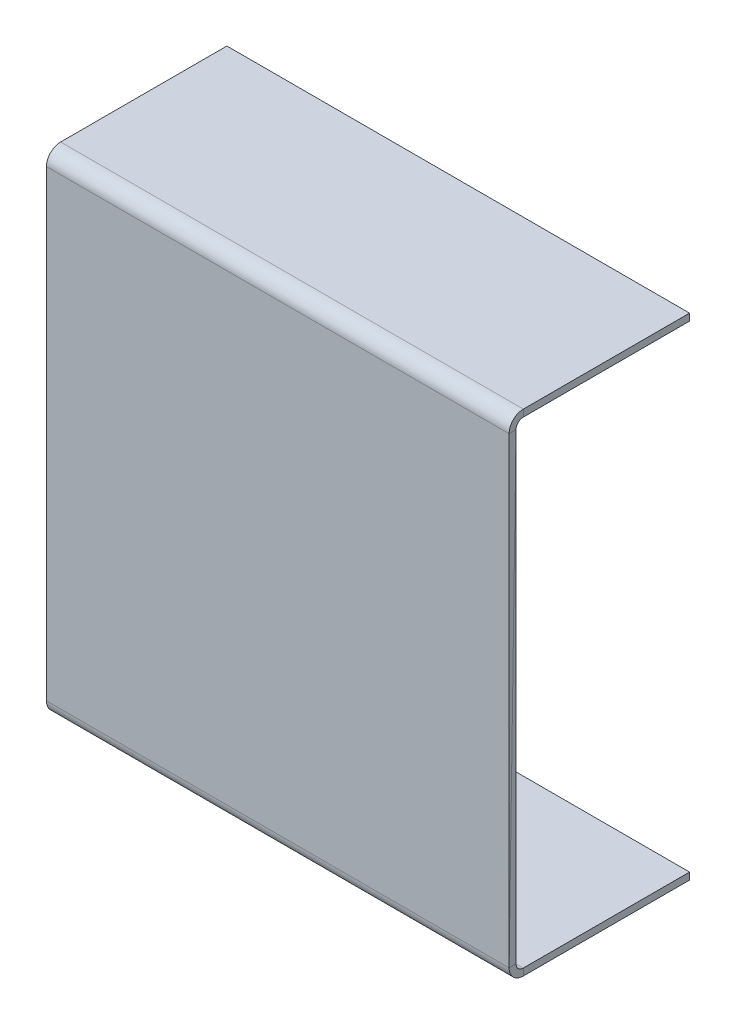
ISO-10303-21;
HEADER;
FILE_DESCRIPTION(('STEP AP214'),'2;1');
FILE_NAME('part.step','',(''),(''),'','','');
FILE_SCHEMA(('AUTOMOTIVE_DESIGN { 1 0 10303 214 1 1 1 1 }'));
ENDSEC;
DATA;
#1=APPLICATION_CONTEXT('core data for automotive mechanical design processes');
#2=APPLICATION_PROTOCOL_DEFINITION('international standard','automotive_design',2000,#1);
#3=PRODUCT_CONTEXT('',#1,'mechanical');
#4=PRODUCT('Part','Part','',(#3));
#5=PRODUCT_RELATED_PRODUCT_CATEGORY('part','',(#4));
#6=PRODUCT_DEFINITION_FORMATION('','',#4);
#7=PRODUCT_DEFINITION_CONTEXT('part definition',#1,'design');
#8=PRODUCT_DEFINITION('design','',#6,#7);
#9=PRODUCT_DEFINITION_SHAPE('','',#8);
#10=(LENGTH_UNIT() NAMED_UNIT(*) SI_UNIT(.MILLI.,.METRE.));
#11=(NAMED_UNIT(*) PLANE_ANGLE_UNIT() SI_UNIT($,.RADIAN.));
#12=(NAMED_UNIT(*) SI_UNIT($,.STERADIAN.) SOLID_ANGLE_UNIT());
#13=UNCERTAINTY_MEASURE_WITH_UNIT(LENGTH_MEASURE(1.E-05),#10,'distance_accuracy_value','');
#14=(GEOMETRIC_REPRESENTATION_CONTEXT(3) GLOBAL_UNCERTAINTY_ASSIGNED_CONTEXT((#13)) GLOBAL_UNIT_ASSIGNED_CONTEXT((#10,
#11,#12)) REPRESENTATION_CONTEXT('',''));
#15=CARTESIAN_POINT('',(0.,0.,0.));
#16=DIRECTION('',(0.,0.,1.));
#17=DIRECTION('',(1.,0.,0.));
#18=AXIS2_PLACEMENT_3D('',#15,#16,#17);
#19=CARTESIAN_POINT('',(101.6,0.,1.524));
#20=DIRECTION('',(-1.,0.,0.));
#21=DIRECTION('',(0.,1.,0.));
#22=AXIS2_PLACEMENT_3D('',#19,#20,#21);
#23=PLANE('',#22);
#24=DIRECTION('',(0.,0.,1.));
#25=VECTOR('',#24,1.);
#26=CARTESIAN_POINT('',(101.6,0.,1.524));
#27=LINE('',#26,#25);
#28=CARTESIAN_POINT('',(101.6,0.,0.));
#29=VERTEX_POINT('',#28);
#30=CARTESIAN_POINT('',(101.6,0.,1.524));
#31=VERTEX_POINT('',#30);
#32=EDGE_CURVE('E14',#29,#31,#27,.T.);
#33=ORIENTED_EDGE('',*,*,#32,.F.);
#34=DIRECTION('',(0.,1.,0.));
#35=VECTOR('',#34,1.);
#36=CARTESIAN_POINT('',(101.6,0.,0.));
#37=LINE('',#36,#35);
#38=CARTESIAN_POINT('',(101.6,101.6,0.));
#39=VERTEX_POINT('',#38);
#40=EDGE_CURVE('E287',#29,#39,#37,.T.);
#41=ORIENTED_EDGE('',*,*,#40,.T.);
#42=DIRECTION('',(0.,0.,1.));
#43=VECTOR('',#42,1.);
#44=CARTESIAN_POINT('',(101.6,101.6,1.524));
#45=LINE('',#44,#43);
#46=CARTESIAN_POINT('',(101.6,101.6,1.52399999999999));
#47=VERTEX_POINT('',#46);
#48=EDGE_CURVE('E97',#39,#47,#45,.T.);
#49=ORIENTED_EDGE('',*,*,#48,.T.);
#50=DIRECTION('',(0.,1.,0.));
#51=VECTOR('',#50,1.);
#52=CARTESIAN_POINT('',(101.6,0.,1.524));
#53=LINE('',#52,#51);
#54=EDGE_CURVE('E277',#31,#47,#53,.T.);
#55=ORIENTED_EDGE('',*,*,#54,.F.);
#56=EDGE_LOOP('',(#33,#41,#49,#55));
#57=FACE_BOUND('',#56,.T.);
#58=ADVANCED_FACE('F89',(#57),#23,.F.);
#59=CARTESIAN_POINT('',(0.,0.,1.524));
#60=DIRECTION('',(1.,0.,0.));
#61=DIRECTION('',(0.,-1.,0.));
#62=AXIS2_PLACEMENT_3D('',#59,#60,#61);
#63=PLANE('',#62);
#64=DIRECTION('',(0.,0.,1.));
#65=VECTOR('',#64,1.);
#66=CARTESIAN_POINT('',(0.,101.6,1.524));
#67=LINE('',#66,#65);
#68=CARTESIAN_POINT('',(0.,101.6,0.));
#69=VERTEX_POINT('',#68);
#70=CARTESIAN_POINT('',(0.,101.6,1.524));
#71=VERTEX_POINT('',#70);
#72=EDGE_CURVE('E291',#69,#71,#67,.T.);
#73=ORIENTED_EDGE('',*,*,#72,.F.);
#74=DIRECTION('',(0.,1.,0.));
#75=VECTOR('',#74,1.);
#76=CARTESIAN_POINT('',(0.,0.,0.));
#77=LINE('',#76,#75);
#78=CARTESIAN_POINT('',(0.,0.,0.));
#79=VERTEX_POINT('',#78);
#80=EDGE_CURVE('E261',#69,#79,#77,.F.);
#81=ORIENTED_EDGE('',*,*,#80,.T.);
#82=DIRECTION('',(0.,0.,1.));
#83=VECTOR('',#82,1.);
#84=CARTESIAN_POINT('',(0.,0.,1.524));
#85=LINE('',#84,#83);
#86=CARTESIAN_POINT('',(0.,0.,1.524));
#87=VERTEX_POINT('',#86);
#88=EDGE_CURVE('E92',#79,#87,#85,.T.);
#89=ORIENTED_EDGE('',*,*,#88,.T.);
#90=DIRECTION('',(0.,-1.,0.));
#91=VECTOR('',#90,1.);
#92=CARTESIAN_POINT('',(0.,0.,1.524));
#93=LINE('',#92,#91);
#94=EDGE_CURVE('E270',#71,#87,#93,.T.);
#95=ORIENTED_EDGE('',*,*,#94,.F.);
#96=EDGE_LOOP('',(#73,#81,#89,#95));
#97=FACE_BOUND('',#96,.T.);
#98=ADVANCED_FACE('F313',(#97),#63,.F.);
#99=CARTESIAN_POINT('',(0.,0.,1.524));
#100=DIRECTION('',(0.,0.,-1.));
#101=DIRECTION('',(-1.,0.,0.));
#102=AXIS2_PLACEMENT_3D('',#99,#100,#101);
#103=PLANE('',#102);
#104=ORIENTED_EDGE('',*,*,#94,.T.);
#105=DIRECTION('',(1.,0.,0.));
#106=VECTOR('',#105,1.);
#107=CARTESIAN_POINT('',(0.,0.,1.524));
#108=LINE('',#107,#106);
#109=EDGE_CURVE('E273',#87,#31,#108,.T.);
#110=ORIENTED_EDGE('',*,*,#109,.T.);
#111=ORIENTED_EDGE('',*,*,#54,.T.);
#112=DIRECTION('',(-1.,0.,0.));
#113=VECTOR('',#112,1.);
#114=CARTESIAN_POINT('',(0.,101.6,1.524));
#115=LINE('',#114,#113);
#116=EDGE_CURVE('E280',#47,#71,#115,.T.);
#117=ORIENTED_EDGE('',*,*,#116,.T.);
#118=EDGE_LOOP('',(#104,#110,#111,#117));
#119=FACE_BOUND('',#118,.T.);
#120=ADVANCED_FACE('F302',(#119),#103,.F.);
#121=CARTESIAN_POINT('',(0.,0.,0.));
#122=DIRECTION('',(0.,0.,-1.));
#123=DIRECTION('',(-1.,0.,0.));
#124=AXIS2_PLACEMENT_3D('',#121,#122,#123);
#125=PLANE('',#124);
#126=ORIENTED_EDGE('',*,*,#80,.F.);
#127=DIRECTION('',(-1.,0.,0.));
#128=VECTOR('',#127,1.);
#129=CARTESIAN_POINT('',(0.,101.6,0.));
#130=LINE('',#129,#128);
#131=EDGE_CURVE('E274',#39,#69,#130,.T.);
#132=ORIENTED_EDGE('',*,*,#131,.F.);
#133=ORIENTED_EDGE('',*,*,#40,.F.);
#134=DIRECTION('',(-1.,0.,0.));
#135=VECTOR('',#134,1.);
#136=CARTESIAN_POINT('',(0.,0.,0.));
#137=LINE('',#136,#135);
#138=EDGE_CURVE('E285',#79,#29,#137,.F.);
#139=ORIENTED_EDGE('',*,*,#138,.F.);
#140=EDGE_LOOP('',(#126,#132,#133,#139));
#141=FACE_BOUND('',#140,.T.);
#142=ADVANCED_FACE('F317',(#141),#125,.T.);
#143=CARTESIAN_POINT('',(101.6,0.,-1.5875));
#144=DIRECTION('',(1.,0.,0.));
#145=DIRECTION('',(0.,1.,0.));
#146=AXIS2_PLACEMENT_3D('',#143,#144,#145);
#147=PLANE('',#146);
#148=DIRECTION('',(0.,1.,0.));
#149=VECTOR('',#148,1.);
#150=CARTESIAN_POINT('',(101.6,-3.1115,-1.58749999999999));
#151=LINE('',#150,#149);
#152=CARTESIAN_POINT('',(101.6,-1.5875,-1.58749999999999));
#153=VERTEX_POINT('',#152);
#154=CARTESIAN_POINT('',(101.6,-3.1115,-1.58749999999999));
#155=VERTEX_POINT('',#154);
#156=EDGE_CURVE('E220',#153,#155,#151,.F.);
#157=ORIENTED_EDGE('',*,*,#156,.F.);
#158=CARTESIAN_POINT('',(101.6,0.,-1.5875));
#159=DIRECTION('',(-1.,0.,0.));
#160=DIRECTION('',(0.,-1.,0.));
#161=AXIS2_PLACEMENT_3D('',#158,#159,#160);
#162=CIRCLE('',#161,1.5875);
#163=EDGE_CURVE('E265',#29,#153,#162,.F.);
#164=ORIENTED_EDGE('',*,*,#163,.F.);
#165=ORIENTED_EDGE('',*,*,#32,.T.);
#166=CARTESIAN_POINT('',(101.6,0.,-1.5875));
#167=DIRECTION('',(-1.,0.,0.));
#168=DIRECTION('',(0.,-1.,0.));
#169=AXIS2_PLACEMENT_3D('',#166,#167,#168);
#170=CIRCLE('',#169,3.1115);
#171=EDGE_CURVE('E112',#31,#155,#170,.F.);
#172=ORIENTED_EDGE('',*,*,#171,.T.);
#173=EDGE_LOOP('',(#157,#164,#165,#172));
#174=FACE_BOUND('',#173,.T.);
#175=ADVANCED_FACE('F323',(#174),#147,.T.);
#176=CARTESIAN_POINT('',(0.,0.,-1.5875));
#177=DIRECTION('',(1.,0.,0.));
#178=DIRECTION('',(0.,1.,0.));
#179=AXIS2_PLACEMENT_3D('',#176,#177,#178);
#180=PLANE('',#179);
#181=CARTESIAN_POINT('',(0.,0.,-1.5875));
#182=DIRECTION('',(-1.,0.,0.));
#183=DIRECTION('',(0.,-1.,0.));
#184=AXIS2_PLACEMENT_3D('',#181,#182,#183);
#185=CIRCLE('',#184,1.5875);
#186=CARTESIAN_POINT('',(0.,-1.58750000000001,-1.58749999999999));
#187=VERTEX_POINT('',#186);
#188=EDGE_CURVE('E233',#187,#79,#185,.T.);
#189=ORIENTED_EDGE('',*,*,#188,.F.);
#190=DIRECTION('',(0.,1.,0.));
#191=VECTOR('',#190,1.);
#192=CARTESIAN_POINT('',(0.,-1.5875,-1.58749999999999));
#193=LINE('',#192,#191);
#194=CARTESIAN_POINT('',(0.,-3.1115,-1.58749999999999));
#195=VERTEX_POINT('',#194);
#196=EDGE_CURVE('E253',#187,#195,#193,.F.);
#197=ORIENTED_EDGE('',*,*,#196,.T.);
#198=CARTESIAN_POINT('',(0.,0.,-1.5875));
#199=DIRECTION('',(-1.,0.,0.));
#200=DIRECTION('',(0.,-1.,0.));
#201=AXIS2_PLACEMENT_3D('',#198,#199,#200);
#202=CIRCLE('',#201,3.1115);
#203=EDGE_CURVE('E262',#195,#87,#202,.T.);
#204=ORIENTED_EDGE('',*,*,#203,.T.);
#205=ORIENTED_EDGE('',*,*,#88,.F.);
#206=EDGE_LOOP('',(#189,#197,#204,#205));
#207=FACE_BOUND('',#206,.T.);
#208=ADVANCED_FACE('F308',(#207),#180,.F.);
#209=CARTESIAN_POINT('',(0.,0.,-1.5875));
#210=DIRECTION('',(-1.,0.,0.));
#211=DIRECTION('',(0.,-1.,0.));
#212=AXIS2_PLACEMENT_3D('',#209,#210,#211);
#213=CYLINDRICAL_SURFACE('',#212,3.1115);
#214=ORIENTED_EDGE('',*,*,#109,.F.);
#215=ORIENTED_EDGE('',*,*,#203,.F.);
#216=DIRECTION('',(-1.,0.,0.));
#217=VECTOR('',#216,1.);
#218=CARTESIAN_POINT('',(101.6,-3.1115,-1.58749999999999));
#219=LINE('',#218,#217);
#220=EDGE_CURVE('E251',#195,#155,#219,.F.);
#221=ORIENTED_EDGE('',*,*,#220,.T.);
#222=ORIENTED_EDGE('',*,*,#171,.F.);
#223=EDGE_LOOP('',(#214,#215,#221,#222));
#224=FACE_BOUND('',#223,.T.);
#225=ADVANCED_FACE('F304',(#224),#213,.T.);
#226=CARTESIAN_POINT('',(0.,0.,-1.5875));
#227=DIRECTION('',(-1.,0.,0.));
#228=DIRECTION('',(0.,-1.,0.));
#229=AXIS2_PLACEMENT_3D('',#226,#227,#228);
#230=CYLINDRICAL_SURFACE('',#229,1.5875);
#231=ORIENTED_EDGE('',*,*,#138,.T.);
#232=ORIENTED_EDGE('',*,*,#163,.T.);
#233=DIRECTION('',(-1.,0.,0.));
#234=VECTOR('',#233,1.);
#235=CARTESIAN_POINT('',(101.6,-1.5875,-1.58749999999999));
#236=LINE('',#235,#234);
#237=EDGE_CURVE('E256',#153,#187,#236,.T.);
#238=ORIENTED_EDGE('',*,*,#237,.T.);
#239=ORIENTED_EDGE('',*,*,#188,.T.);
#240=EDGE_LOOP('',(#231,#232,#238,#239));
#241=FACE_BOUND('',#240,.T.);
#242=ADVANCED_FACE('F320',(#241),#230,.F.);
#243=CARTESIAN_POINT('',(0.,-3.11150000000013,-38.1));
#244=DIRECTION('',(1.,0.,0.));
#245=DIRECTION('',(0.,0.,-1.));
#246=AXIS2_PLACEMENT_3D('',#243,#244,#245);
#247=PLANE('',#246);
#248=ORIENTED_EDGE('',*,*,#196,.F.);
#249=DIRECTION('',(0.,0.,1.));
#250=VECTOR('',#249,1.);
#251=CARTESIAN_POINT('',(0.,-1.58750000000013,-38.1));
#252=LINE('',#251,#250);
#253=CARTESIAN_POINT('',(0.,-1.58750000000013,-38.1));
#254=VERTEX_POINT('',#253);
#255=EDGE_CURVE('E249',#187,#254,#252,.F.);
#256=ORIENTED_EDGE('',*,*,#255,.T.);
#257=DIRECTION('',(0.,1.,0.));
#258=VECTOR('',#257,1.);
#259=CARTESIAN_POINT('',(0.,-3.11150000000013,-38.1));
#260=LINE('',#259,#258);
#261=CARTESIAN_POINT('',(0.,-3.11150000000013,-38.1));
#262=VERTEX_POINT('',#261);
#263=EDGE_CURVE('E230',#262,#254,#260,.T.);
#264=ORIENTED_EDGE('',*,*,#263,.F.);
#265=DIRECTION('',(0.,0.,-1.));
#266=VECTOR('',#265,1.);
#267=CARTESIAN_POINT('',(0.,-3.11149999999999,0.));
#268=LINE('',#267,#266);
#269=EDGE_CURVE('E242',#195,#262,#268,.T.);
#270=ORIENTED_EDGE('',*,*,#269,.F.);
#271=EDGE_LOOP('',(#248,#256,#264,#270));
#272=FACE_BOUND('',#271,.T.);
#273=ADVANCED_FACE('F341',(#272),#247,.F.);
#274=CARTESIAN_POINT('',(101.6,-3.11149999999999,0.));
#275=DIRECTION('',(-1.,0.,0.));
#276=DIRECTION('',(0.,0.,1.));
#277=AXIS2_PLACEMENT_3D('',#274,#275,#276);
#278=PLANE('',#277);
#279=ORIENTED_EDGE('',*,*,#156,.T.);
#280=DIRECTION('',(0.,0.,1.));
#281=VECTOR('',#280,1.);
#282=CARTESIAN_POINT('',(101.6,-3.11149999999999,0.));
#283=LINE('',#282,#281);
#284=CARTESIAN_POINT('',(101.6,-3.11150000000013,-38.1));
#285=VERTEX_POINT('',#284);
#286=EDGE_CURVE('E237',#285,#155,#283,.T.);
#287=ORIENTED_EDGE('',*,*,#286,.F.);
#288=DIRECTION('',(0.,1.,0.));
#289=VECTOR('',#288,1.);
#290=CARTESIAN_POINT('',(101.6,-3.11150000000013,-38.1));
#291=LINE('',#290,#289);
#292=CARTESIAN_POINT('',(101.6,-1.58750000000013,-38.1));
#293=VERTEX_POINT('',#292);
#294=EDGE_CURVE('E234',#285,#293,#291,.T.);
#295=ORIENTED_EDGE('',*,*,#294,.T.);
#296=DIRECTION('',(0.,0.,-1.));
#297=VECTOR('',#296,1.);
#298=CARTESIAN_POINT('',(101.6,-1.58749999999999,0.));
#299=LINE('',#298,#297);
#300=EDGE_CURVE('E244',#293,#153,#299,.F.);
#301=ORIENTED_EDGE('',*,*,#300,.T.);
#302=EDGE_LOOP('',(#279,#287,#295,#301));
#303=FACE_BOUND('',#302,.T.);
#304=ADVANCED_FACE('F326',(#303),#278,.F.);
#305=CARTESIAN_POINT('',(0.,-3.11149999999999,0.));
#306=DIRECTION('',(0.,1.,0.));
#307=DIRECTION('',(0.,0.,1.));
#308=AXIS2_PLACEMENT_3D('',#305,#306,#307);
#309=PLANE('',#308);
#310=ORIENTED_EDGE('',*,*,#220,.F.);
#311=ORIENTED_EDGE('',*,*,#269,.T.);
#312=DIRECTION('',(1.,0.,0.));
#313=VECTOR('',#312,1.);
#314=CARTESIAN_POINT('',(0.,-3.11150000000013,-38.1));
#315=LINE('',#314,#313);
#316=EDGE_CURVE('E240',#262,#285,#315,.T.);
#317=ORIENTED_EDGE('',*,*,#316,.T.);
#318=ORIENTED_EDGE('',*,*,#286,.T.);
#319=EDGE_LOOP('',(#310,#311,#317,#318));
#320=FACE_BOUND('',#319,.T.);
#321=ADVANCED_FACE('F329',(#320),#309,.F.);
#322=CARTESIAN_POINT('',(0.,-1.58749999999999,0.));
#323=DIRECTION('',(0.,1.,0.));
#324=DIRECTION('',(0.,0.,1.));
#325=AXIS2_PLACEMENT_3D('',#322,#323,#324);
#326=PLANE('',#325);
#327=ORIENTED_EDGE('',*,*,#255,.F.);
#328=ORIENTED_EDGE('',*,*,#237,.F.);
#329=ORIENTED_EDGE('',*,*,#300,.F.);
#330=DIRECTION('',(-1.,0.,0.));
#331=VECTOR('',#330,1.);
#332=CARTESIAN_POINT('',(101.6,-1.58750000000013,-38.1));
#333=LINE('',#332,#331);
#334=EDGE_CURVE('E247',#254,#293,#333,.F.);
#335=ORIENTED_EDGE('',*,*,#334,.F.);
#336=EDGE_LOOP('',(#327,#328,#329,#335));
#337=FACE_BOUND('',#336,.T.);
#338=ADVANCED_FACE('F339',(#337),#326,.T.);
#339=CARTESIAN_POINT('',(101.6,-3.11150000000013,-38.1));
#340=DIRECTION('',(0.,0.,1.));
#341=DIRECTION('',(0.,-1.,0.));
#342=AXIS2_PLACEMENT_3D('',#339,#340,#341);
#343=PLANE('',#342);
#344=ORIENTED_EDGE('',*,*,#334,.T.);
#345=ORIENTED_EDGE('',*,*,#294,.F.);
#346=ORIENTED_EDGE('',*,*,#316,.F.);
#347=ORIENTED_EDGE('',*,*,#263,.T.);
#348=EDGE_LOOP('',(#344,#345,#346,#347));
#349=FACE_BOUND('',#348,.T.);
#350=ADVANCED_FACE('F335',(#349),#343,.F.);
#351=CARTESIAN_POINT('',(0.,101.6,-1.5875));
#352=DIRECTION('',(-1.,0.,0.));
#353=DIRECTION('',(0.,0.,1.));
#354=AXIS2_PLACEMENT_3D('',#351,#352,#353);
#355=PLANE('',#354);
#356=DIRECTION('',(0.,-1.,0.));
#357=VECTOR('',#356,1.);
#358=CARTESIAN_POINT('',(0.,104.7115,-1.58749999999999));
#359=LINE('',#358,#357);
#360=CARTESIAN_POINT('',(0.,103.1875,-1.58749999999999));
#361=VERTEX_POINT('',#360);
#362=CARTESIAN_POINT('',(0.,104.7115,-1.58749999999999));
#363=VERTEX_POINT('',#362);
#364=EDGE_CURVE('E201',#361,#363,#359,.F.);
#365=ORIENTED_EDGE('',*,*,#364,.F.);
#366=CARTESIAN_POINT('',(0.,101.6,-1.5875));
#367=DIRECTION('',(1.,0.,0.));
#368=DIRECTION('',(0.,0.,-1.));
#369=AXIS2_PLACEMENT_3D('',#366,#367,#368);
#370=CIRCLE('',#369,1.58749999999999);
#371=EDGE_CURVE('E224',#69,#361,#370,.F.);
#372=ORIENTED_EDGE('',*,*,#371,.F.);
#373=ORIENTED_EDGE('',*,*,#72,.T.);
#374=CARTESIAN_POINT('',(0.,101.6,-1.5875));
#375=DIRECTION('',(1.,0.,0.));
#376=DIRECTION('',(0.,0.,-1.));
#377=AXIS2_PLACEMENT_3D('',#374,#375,#376);
#378=CIRCLE('',#377,3.11149999999999);
#379=EDGE_CURVE('E104',#71,#363,#378,.F.);
#380=ORIENTED_EDGE('',*,*,#379,.T.);
#381=EDGE_LOOP('',(#365,#372,#373,#380));
#382=FACE_BOUND('',#381,.T.);
#383=ADVANCED_FACE('F414',(#382),#355,.T.);
#384=CARTESIAN_POINT('',(101.6,101.6,-1.5875));
#385=DIRECTION('',(-1.,0.,0.));
#386=DIRECTION('',(0.,0.,1.));
#387=AXIS2_PLACEMENT_3D('',#384,#385,#386);
#388=PLANE('',#387);
#389=CARTESIAN_POINT('',(101.6,101.6,-1.5875));
#390=DIRECTION('',(1.,0.,0.));
#391=DIRECTION('',(0.,0.,-1.));
#392=AXIS2_PLACEMENT_3D('',#389,#390,#391);
#393=CIRCLE('',#392,1.58749999999999);
#394=CARTESIAN_POINT('',(101.6,103.1875,-1.58749999999999));
#395=VERTEX_POINT('',#394);
#396=EDGE_CURVE('E227',#395,#39,#393,.T.);
#397=ORIENTED_EDGE('',*,*,#396,.F.);
#398=DIRECTION('',(0.,-1.,0.));
#399=VECTOR('',#398,1.);
#400=CARTESIAN_POINT('',(101.6,103.1875,-1.58749999999999));
#401=LINE('',#400,#399);
#402=CARTESIAN_POINT('',(101.6,104.7115,-1.58749999999999));
#403=VERTEX_POINT('',#402);
#404=EDGE_CURVE('E213',#395,#403,#401,.F.);
#405=ORIENTED_EDGE('',*,*,#404,.T.);
#406=CARTESIAN_POINT('',(101.6,101.6,-1.5875));
#407=DIRECTION('',(1.,0.,0.));
#408=DIRECTION('',(0.,0.,-1.));
#409=AXIS2_PLACEMENT_3D('',#406,#407,#408);
#410=CIRCLE('',#409,3.11149999999999);
#411=EDGE_CURVE('E221',#403,#47,#410,.T.);
#412=ORIENTED_EDGE('',*,*,#411,.T.);
#413=ORIENTED_EDGE('',*,*,#48,.F.);
#414=EDGE_LOOP('',(#397,#405,#412,#413));
#415=FACE_BOUND('',#414,.T.);
#416=ADVANCED_FACE('F449',(#415),#388,.F.);
#417=CARTESIAN_POINT('',(101.6,101.6,-1.5875));
#418=DIRECTION('',(1.,0.,0.));
#419=DIRECTION('',(0.,1.,0.));
#420=AXIS2_PLACEMENT_3D('',#417,#418,#419);
#421=CYLINDRICAL_SURFACE('',#420,3.11149999999999);
#422=ORIENTED_EDGE('',*,*,#116,.F.);
#423=ORIENTED_EDGE('',*,*,#411,.F.);
#424=DIRECTION('',(1.,0.,0.));
#425=VECTOR('',#424,1.);
#426=CARTESIAN_POINT('',(0.,104.7115,-1.58749999999999));
#427=LINE('',#426,#425);
#428=EDGE_CURVE('E211',#403,#363,#427,.F.);
#429=ORIENTED_EDGE('',*,*,#428,.T.);
#430=ORIENTED_EDGE('',*,*,#379,.F.);
#431=EDGE_LOOP('',(#422,#423,#429,#430));
#432=FACE_BOUND('',#431,.T.);
#433=ADVANCED_FACE('F460',(#432),#421,.T.);
#434=CARTESIAN_POINT('',(101.6,101.6,-1.5875));
#435=DIRECTION('',(1.,0.,0.));
#436=DIRECTION('',(0.,1.,0.));
#437=AXIS2_PLACEMENT_3D('',#434,#435,#436);
#438=CYLINDRICAL_SURFACE('',#437,1.58749999999999);
#439=ORIENTED_EDGE('',*,*,#131,.T.);
#440=ORIENTED_EDGE('',*,*,#371,.T.);
#441=DIRECTION('',(1.,0.,0.));
#442=VECTOR('',#441,1.);
#443=CARTESIAN_POINT('',(0.,103.1875,-1.58749999999999));
#444=LINE('',#443,#442);
#445=EDGE_CURVE('E216',#361,#395,#444,.T.);
#446=ORIENTED_EDGE('',*,*,#445,.T.);
#447=ORIENTED_EDGE('',*,*,#396,.T.);
#448=EDGE_LOOP('',(#439,#440,#446,#447));
#449=FACE_BOUND('',#448,.T.);
#450=ADVANCED_FACE('F470',(#449),#438,.F.);
#451=CARTESIAN_POINT('',(101.6,104.7115,-38.1));
#452=DIRECTION('',(-1.,0.,0.));
#453=DIRECTION('',(0.,0.,1.));
#454=AXIS2_PLACEMENT_3D('',#451,#452,#453);
#455=PLANE('',#454);
#456=ORIENTED_EDGE('',*,*,#404,.F.);
#457=DIRECTION('',(0.,0.,1.));
#458=VECTOR('',#457,1.);
#459=CARTESIAN_POINT('',(101.6,103.1875,-38.1));
#460=LINE('',#459,#458);
#461=CARTESIAN_POINT('',(101.6,103.1875,-38.1));
#462=VERTEX_POINT('',#461);
#463=EDGE_CURVE('E209',#395,#462,#460,.F.);
#464=ORIENTED_EDGE('',*,*,#463,.T.);
#465=DIRECTION('',(0.,-1.,0.));
#466=VECTOR('',#465,1.);
#467=CARTESIAN_POINT('',(101.6,104.7115,-38.1));
#468=LINE('',#467,#466);
#469=CARTESIAN_POINT('',(101.6,104.7115,-38.1));
#470=VERTEX_POINT('',#469);
#471=EDGE_CURVE('E197',#470,#462,#468,.T.);
#472=ORIENTED_EDGE('',*,*,#471,.F.);
#473=DIRECTION('',(0.,0.,-1.));
#474=VECTOR('',#473,1.);
#475=CARTESIAN_POINT('',(101.6,104.7115,3.75395359102116E-13));
#476=LINE('',#475,#474);
#477=EDGE_CURVE('E184',#403,#470,#476,.T.);
#478=ORIENTED_EDGE('',*,*,#477,.F.);
#479=EDGE_LOOP('',(#456,#464,#472,#478));
#480=FACE_BOUND('',#479,.T.);
#481=ADVANCED_FACE('F480',(#480),#455,.F.);
#482=CARTESIAN_POINT('',(0.,104.7115,0.));
#483=DIRECTION('',(1.,0.,0.));
#484=DIRECTION('',(0.,0.,-1.));
#485=AXIS2_PLACEMENT_3D('',#482,#483,#484);
#486=PLANE('',#485);
#487=ORIENTED_EDGE('',*,*,#364,.T.);
#488=DIRECTION('',(0.,0.,1.));
#489=VECTOR('',#488,1.);
#490=CARTESIAN_POINT('',(0.,104.7115,3.75395359102116E-13));
#491=LINE('',#490,#489);
#492=CARTESIAN_POINT('',(0.,104.7115,-38.1));
#493=VERTEX_POINT('',#492);
#494=EDGE_CURVE('E182',#493,#363,#491,.T.);
#495=ORIENTED_EDGE('',*,*,#494,.F.);
#496=DIRECTION('',(0.,-1.,0.));
#497=VECTOR('',#496,1.);
#498=CARTESIAN_POINT('',(0.,104.7115,-38.1));
#499=LINE('',#498,#497);
#500=CARTESIAN_POINT('',(0.,103.1875,-38.1));
#501=VERTEX_POINT('',#500);
#502=EDGE_CURVE('E190',#493,#501,#499,.T.);
#503=ORIENTED_EDGE('',*,*,#502,.T.);
#504=DIRECTION('',(0.,0.,-1.));
#505=VECTOR('',#504,1.);
#506=CARTESIAN_POINT('',(0.,103.1875,0.));
#507=LINE('',#506,#505);
#508=EDGE_CURVE('E206',#501,#361,#507,.F.);
#509=ORIENTED_EDGE('',*,*,#508,.T.);
#510=EDGE_LOOP('',(#487,#495,#503,#509));
#511=FACE_BOUND('',#510,.T.);
#512=ADVANCED_FACE('F200',(#511),#486,.F.);
#513=CARTESIAN_POINT('',(0.,104.7115,3.75395359102116E-13));
#514=DIRECTION('',(0.,-1.,0.));
#515=DIRECTION('',(0.,0.,-1.));
#516=AXIS2_PLACEMENT_3D('',#513,#514,#515);
#517=PLANE('',#516);
#518=ORIENTED_EDGE('',*,*,#428,.F.);
#519=ORIENTED_EDGE('',*,*,#477,.T.);
#520=DIRECTION('',(-1.,0.,0.));
#521=VECTOR('',#520,1.);
#522=CARTESIAN_POINT('',(0.,104.7115,-38.1));
#523=LINE('',#522,#521);
#524=EDGE_CURVE('E177',#470,#493,#523,.T.);
#525=ORIENTED_EDGE('',*,*,#524,.T.);
#526=ORIENTED_EDGE('',*,*,#494,.T.);
#527=EDGE_LOOP('',(#518,#519,#525,#526));
#528=FACE_BOUND('',#527,.T.);
#529=ADVANCED_FACE('F180',(#528),#517,.F.);
#530=CARTESIAN_POINT('',(0.,103.1875,3.70074341541719E-13));
#531=DIRECTION('',(0.,-1.,0.));
#532=DIRECTION('',(0.,0.,-1.));
#533=AXIS2_PLACEMENT_3D('',#530,#531,#532);
#534=PLANE('',#533);
#535=ORIENTED_EDGE('',*,*,#463,.F.);
#536=ORIENTED_EDGE('',*,*,#445,.F.);
#537=ORIENTED_EDGE('',*,*,#508,.F.);
#538=DIRECTION('',(1.,0.,0.));
#539=VECTOR('',#538,1.);
#540=CARTESIAN_POINT('',(0.,103.1875,-38.1));
#541=LINE('',#540,#539);
#542=EDGE_CURVE('E193',#462,#501,#541,.F.);
#543=ORIENTED_EDGE('',*,*,#542,.F.);
#544=EDGE_LOOP('',(#535,#536,#537,#543));
#545=FACE_BOUND('',#544,.T.);
#546=ADVANCED_FACE('F510',(#545),#534,.T.);
#547=CARTESIAN_POINT('',(0.,104.7115,-38.1));
#548=DIRECTION('',(0.,0.,1.));
#549=DIRECTION('',(0.,-1.,0.));
#550=AXIS2_PLACEMENT_3D('',#547,#548,#549);
#551=PLANE('',#550);
#552=ORIENTED_EDGE('',*,*,#542,.T.);
#553=ORIENTED_EDGE('',*,*,#502,.F.);
#554=ORIENTED_EDGE('',*,*,#524,.F.);
#555=ORIENTED_EDGE('',*,*,#471,.T.);
#556=EDGE_LOOP('',(#552,#553,#554,#555));
#557=FACE_BOUND('',#556,.T.);
#558=ADVANCED_FACE('F191',(#557),#551,.F.);
#559=CLOSED_SHELL('',(#58,#98,#120,#142,#175,#208,#225,#242,#273,#304,#321,#338,#350,#383,#416,
#433,#450,#481,#512,#529,#546,#558));
#560=MANIFOLD_SOLID_BREP('B2',#559);
#561=CARTESIAN_POINT('',(0.,0.,1.524));
#562=DIRECTION('',(1.,0.,0.));
#563=DIRECTION('',(0.,1.,0.));
#564=AXIS2_PLACEMENT_3D('',#561,#562,#563);
#565=PLANE('',#564);
#566=DIRECTION('',(0.,-1.,0.));
#567=VECTOR('',#566,1.);
#568=CARTESIAN_POINT('',(0.,0.,0.));
#569=LINE('',#568,#567);
#570=CARTESIAN_POINT('',(0.,101.6,0.));
#571=VERTEX_POINT('',#570);
#572=CARTESIAN_POINT('',(0.,0.,0.));
#573=VERTEX_POINT('',#572);
#574=EDGE_CURVE('E649',#571,#573,#569,.T.);
#575=ORIENTED_EDGE('',*,*,#574,.T.);
#576=DIRECTION('',(0.,0.,-1.));
#577=VECTOR('',#576,1.);
#578=CARTESIAN_POINT('',(0.,0.,1.524));
#579=LINE('',#578,#577);
#580=CARTESIAN_POINT('',(0.,0.,1.524));
#581=VERTEX_POINT('',#580);
#582=EDGE_CURVE('E87',#581,#573,#579,.T.);
#583=ORIENTED_EDGE('',*,*,#582,.F.);
#584=DIRECTION('',(0.,-1.,0.));
#585=VECTOR('',#584,1.);
#586=CARTESIAN_POINT('',(0.,0.,1.524));
#587=LINE('',#586,#585);
#588=CARTESIAN_POINT('',(0.,101.6,1.524));
#589=VERTEX_POINT('',#588);
#590=EDGE_CURVE('E634',#589,#581,#587,.T.);
#591=ORIENTED_EDGE('',*,*,#590,.F.);
#592=DIRECTION('',(0.,0.,-1.));
#593=VECTOR('',#592,1.);
#594=CARTESIAN_POINT('',(0.,101.6,1.524));
#595=LINE('',#594,#593);
#596=EDGE_CURVE('E645',#589,#571,#595,.T.);
#597=ORIENTED_EDGE('',*,*,#596,.T.);
#598=EDGE_LOOP('',(#575,#583,#591,#597));
#599=FACE_BOUND('',#598,.T.);
#600=ADVANCED_FACE('F583',(#599),#565,.F.);
#601=CARTESIAN_POINT('',(0.,0.,1.524));
#602=DIRECTION('',(0.,1.,0.));
#603=DIRECTION('',(0.,0.,1.));
#604=AXIS2_PLACEMENT_3D('',#601,#602,#603);
#605=PLANE('',#604);
#606=DIRECTION('',(1.,0.,0.));
#607=VECTOR('',#606,1.);
#608=CARTESIAN_POINT('',(0.,0.,0.));
#609=LINE('',#608,#607);
#610=CARTESIAN_POINT('',(101.6,0.,0.));
#611=VERTEX_POINT('',#610);
#612=EDGE_CURVE('E639',#573,#611,#609,.T.);
#613=ORIENTED_EDGE('',*,*,#612,.T.);
#614=DIRECTION('',(0.,0.,-1.));
#615=VECTOR('',#614,1.);
#616=CARTESIAN_POINT('',(101.6,0.,1.524));
#617=LINE('',#616,#615);
#618=CARTESIAN_POINT('',(101.6,0.,1.524));
#619=VERTEX_POINT('',#618);
#620=EDGE_CURVE('E591',#619,#611,#617,.T.);
#621=ORIENTED_EDGE('',*,*,#620,.F.);
#622=DIRECTION('',(1.,0.,0.));
#623=VECTOR('',#622,1.);
#624=CARTESIAN_POINT('',(0.,0.,1.524));
#625=LINE('',#624,#623);
#626=EDGE_CURVE('E629',#581,#619,#625,.T.);
#627=ORIENTED_EDGE('',*,*,#626,.F.);
#628=ORIENTED_EDGE('',*,*,#582,.T.);
#629=EDGE_LOOP('',(#613,#621,#627,#628));
#630=FACE_BOUND('',#629,.T.);
#631=ADVANCED_FACE('F638',(#630),#605,.F.);
#632=CARTESIAN_POINT('',(101.6,0.,1.524));
#633=DIRECTION('',(-1.,0.,0.));
#634=DIRECTION('',(0.,0.,1.));
#635=AXIS2_PLACEMENT_3D('',#632,#633,#634);
#636=PLANE('',#635);
#637=DIRECTION('',(0.,1.,0.));
#638=VECTOR('',#637,1.);
#639=CARTESIAN_POINT('',(101.6,0.,0.));
#640=LINE('',#639,#638);
#641=CARTESIAN_POINT('',(101.6,101.6,0.));
#642=VERTEX_POINT('',#641);
#643=EDGE_CURVE('E616',#611,#642,#640,.T.);
#644=ORIENTED_EDGE('',*,*,#643,.T.);
#645=DIRECTION('',(0.,0.,-1.));
#646=VECTOR('',#645,1.);
#647=CARTESIAN_POINT('',(101.6,101.6,1.524));
#648=LINE('',#647,#646);
#649=CARTESIAN_POINT('',(101.6,101.6,1.524));
#650=VERTEX_POINT('',#649);
#651=EDGE_CURVE('E640',#650,#642,#648,.T.);
#652=ORIENTED_EDGE('',*,*,#651,.F.);
#653=DIRECTION('',(0.,1.,0.));
#654=VECTOR('',#653,1.);
#655=CARTESIAN_POINT('',(101.6,0.,1.524));
#656=LINE('',#655,#654);
#657=EDGE_CURVE('E632',#619,#650,#656,.T.);
#658=ORIENTED_EDGE('',*,*,#657,.F.);
#659=ORIENTED_EDGE('',*,*,#620,.T.);
#660=EDGE_LOOP('',(#644,#652,#658,#659));
#661=FACE_BOUND('',#660,.T.);
#662=ADVANCED_FACE('F641',(#661),#636,.F.);
#663=CARTESIAN_POINT('',(0.,101.6,1.524));
#664=DIRECTION('',(0.,-1.,0.));
#665=DIRECTION('',(0.,0.,-1.));
#666=AXIS2_PLACEMENT_3D('',#663,#664,#665);
#667=PLANE('',#666);
#668=DIRECTION('',(-1.,0.,0.));
#669=VECTOR('',#668,1.);
#670=CARTESIAN_POINT('',(0.,101.6,0.));
#671=LINE('',#670,#669);
#672=EDGE_CURVE('E622',#642,#571,#671,.T.);
#673=ORIENTED_EDGE('',*,*,#672,.T.);
#674=ORIENTED_EDGE('',*,*,#596,.F.);
#675=DIRECTION('',(-1.,0.,0.));
#676=VECTOR('',#675,1.);
#677=CARTESIAN_POINT('',(0.,101.6,1.524));
#678=LINE('',#677,#676);
#679=EDGE_CURVE('E599',#650,#589,#678,.T.);
#680=ORIENTED_EDGE('',*,*,#679,.F.);
#681=ORIENTED_EDGE('',*,*,#651,.T.);
#682=EDGE_LOOP('',(#673,#674,#680,#681));
#683=FACE_BOUND('',#682,.T.);
#684=ADVANCED_FACE('F656',(#683),#667,.F.);
#685=CARTESIAN_POINT('',(0.,0.,1.524));
#686=DIRECTION('',(0.,0.,-1.));
#687=DIRECTION('',(-1.,0.,0.));
#688=AXIS2_PLACEMENT_3D('',#685,#686,#687);
#689=PLANE('',#688);
#690=ORIENTED_EDGE('',*,*,#590,.T.);
#691=ORIENTED_EDGE('',*,*,#626,.T.);
#692=ORIENTED_EDGE('',*,*,#657,.T.);
#693=ORIENTED_EDGE('',*,*,#679,.T.);
#694=EDGE_LOOP('',(#690,#691,#692,#693));
#695=FACE_BOUND('',#694,.T.);
#696=ADVANCED_FACE('F630',(#695),#689,.F.);
#697=CARTESIAN_POINT('',(0.,0.,0.));
#698=DIRECTION('',(0.,0.,-1.));
#699=DIRECTION('',(-1.,0.,0.));
#700=AXIS2_PLACEMENT_3D('',#697,#698,#699);
#701=PLANE('',#700);
#702=ORIENTED_EDGE('',*,*,#574,.F.);
#703=ORIENTED_EDGE('',*,*,#672,.F.);
#704=ORIENTED_EDGE('',*,*,#643,.F.);
#705=ORIENTED_EDGE('',*,*,#612,.F.);
#706=EDGE_LOOP('',(#702,#703,#704,#705));
#707=FACE_BOUND('',#706,.T.);
#708=ADVANCED_FACE('F659',(#707),#701,.T.);
#709=CLOSED_SHELL('',(#600,#631,#662,#684,#696,#708));
#710=MANIFOLD_SOLID_BREP('B8',#709);
#711=ADVANCED_BREP_SHAPE_REPRESENTATION('',(#18,#560,#710),#14);
#712=SHAPE_DEFINITION_REPRESENTATION(#9,#711);
ENDSEC;
END-ISO-10303-21;
